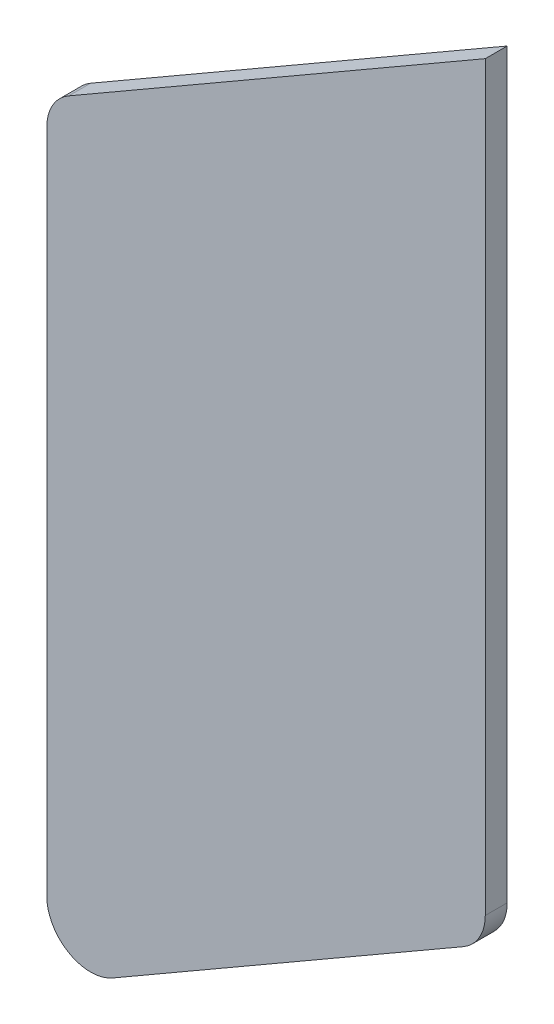
ISO-10303-21;
HEADER;
FILE_DESCRIPTION(('STEP AP214'),'2;1');
FILE_NAME('part.step','',(''),(''),'','','');
FILE_SCHEMA(('AUTOMOTIVE_DESIGN { 1 0 10303 214 1 1 1 1 }'));
ENDSEC;
DATA;
#1=APPLICATION_CONTEXT('core data for automotive mechanical design processes');
#2=APPLICATION_PROTOCOL_DEFINITION('international standard','automotive_design',2000,#1);
#3=PRODUCT_CONTEXT('',#1,'mechanical');
#4=PRODUCT('Part','Part','',(#3));
#5=PRODUCT_RELATED_PRODUCT_CATEGORY('part','',(#4));
#6=PRODUCT_DEFINITION_FORMATION('','',#4);
#7=PRODUCT_DEFINITION_CONTEXT('part definition',#1,'design');
#8=PRODUCT_DEFINITION('design','',#6,#7);
#9=PRODUCT_DEFINITION_SHAPE('','',#8);
#10=(LENGTH_UNIT() NAMED_UNIT(*) SI_UNIT(.MILLI.,.METRE.));
#11=(NAMED_UNIT(*) PLANE_ANGLE_UNIT() SI_UNIT($,.RADIAN.));
#12=(NAMED_UNIT(*) SI_UNIT($,.STERADIAN.) SOLID_ANGLE_UNIT());
#13=UNCERTAINTY_MEASURE_WITH_UNIT(LENGTH_MEASURE(1.E-05),#10,'distance_accuracy_value','');
#14=(GEOMETRIC_REPRESENTATION_CONTEXT(3) GLOBAL_UNCERTAINTY_ASSIGNED_CONTEXT((#13)) GLOBAL_UNIT_ASSIGNED_CONTEXT((#10,
#11,#12)) REPRESENTATION_CONTEXT('',''));
#15=CARTESIAN_POINT('',(0.,0.,0.));
#16=DIRECTION('',(0.,0.,1.));
#17=DIRECTION('',(1.,0.,0.));
#18=AXIS2_PLACEMENT_3D('',#15,#16,#17);
#19=CARTESIAN_POINT('',(47.5000000000002,139.461524227067,5.));
#20=DIRECTION('',(1.,0.,0.));
#21=DIRECTION('',(0.,1.,0.));
#22=AXIS2_PLACEMENT_3D('',#19,#20,#21);
#23=PLANE('',#22);
#24=DIRECTION('',(0.,-1.,0.));
#25=VECTOR('',#24,1.);
#26=CARTESIAN_POINT('',(47.5000000000002,139.461524227067,0.));
#27=LINE('',#26,#25);
#28=CARTESIAN_POINT('',(47.5000000000002,139.461524227067,0.));
#29=VERTEX_POINT('',#28);
#30=CARTESIAN_POINT('',(47.5000000000002,-29.7649730810358,0.));
#31=VERTEX_POINT('',#30);
#32=EDGE_CURVE('E130',#29,#31,#27,.T.);
#33=ORIENTED_EDGE('',*,*,#32,.F.);
#34=DIRECTION('',(0.,0.,-1.));
#35=VECTOR('',#34,1.);
#36=CARTESIAN_POINT('',(47.5000000000002,139.461524227067,5.));
#37=LINE('',#36,#35);
#38=CARTESIAN_POINT('',(47.5000000000002,139.461524227067,5.));
#39=VERTEX_POINT('',#38);
#40=EDGE_CURVE('E11',#39,#29,#37,.T.);
#41=ORIENTED_EDGE('',*,*,#40,.F.);
#42=DIRECTION('',(0.,-1.,0.));
#43=VECTOR('',#42,1.);
#44=CARTESIAN_POINT('',(47.5000000000002,139.461524227067,5.));
#45=LINE('',#44,#43);
#46=CARTESIAN_POINT('',(47.5000000000002,-29.7649730810358,5.));
#47=VERTEX_POINT('',#46);
#48=EDGE_CURVE('E145',#39,#47,#45,.T.);
#49=ORIENTED_EDGE('',*,*,#48,.T.);
#50=DIRECTION('',(0.,0.,-1.));
#51=VECTOR('',#50,1.);
#52=CARTESIAN_POINT('',(47.5000000000002,-29.7649730810358,5.));
#53=LINE('',#52,#51);
#54=EDGE_CURVE('E40',#47,#31,#53,.T.);
#55=ORIENTED_EDGE('',*,*,#54,.T.);
#56=EDGE_LOOP('',(#33,#41,#49,#55));
#57=FACE_BOUND('',#56,.T.);
#58=ADVANCED_FACE('F37',(#57),#23,.T.);
#59=CARTESIAN_POINT('',(47.5000000000002,139.461524227067,5.));
#60=DIRECTION('',(0.500000000000007,-0.866025403784434,0.));
#61=DIRECTION('',(0.866025403784435,0.500000000000007,0.));
#62=AXIS2_PLACEMENT_3D('',#59,#60,#61);
#63=PLANE('',#62);
#64=DIRECTION('',(-0.866025403784435,-0.500000000000007,0.));
#65=VECTOR('',#64,1.);
#66=CARTESIAN_POINT('',(47.5000000000002,139.461524227067,0.));
#67=LINE('',#66,#65);
#68=CARTESIAN_POINT('',(-47.5000000000002,84.6132486540517,0.));
#69=VERTEX_POINT('',#68);
#70=EDGE_CURVE('E79',#29,#69,#67,.T.);
#71=ORIENTED_EDGE('',*,*,#70,.T.);
#72=DIRECTION('',(0.,0.,-1.));
#73=VECTOR('',#72,1.);
#74=CARTESIAN_POINT('',(-47.5000000000002,84.6132486540517,5.));
#75=LINE('',#74,#73);
#76=CARTESIAN_POINT('',(-47.5000000000002,84.6132486540517,5.));
#77=VERTEX_POINT('',#76);
#78=EDGE_CURVE('E46',#77,#69,#75,.T.);
#79=ORIENTED_EDGE('',*,*,#78,.F.);
#80=DIRECTION('',(-0.866025403784435,-0.500000000000007,0.));
#81=VECTOR('',#80,1.);
#82=CARTESIAN_POINT('',(47.5000000000002,139.461524227067,5.));
#83=LINE('',#82,#81);
#84=EDGE_CURVE('E108',#39,#77,#83,.T.);
#85=ORIENTED_EDGE('',*,*,#84,.F.);
#86=ORIENTED_EDGE('',*,*,#40,.T.);
#87=EDGE_LOOP('',(#71,#79,#85,#86));
#88=FACE_BOUND('',#87,.T.);
#89=ADVANCED_FACE('F173',(#88),#63,.F.);
#90=CARTESIAN_POINT('',(-42.4999999999998,75.9529946162071,5.));
#91=DIRECTION('',(0.,0.,-1.));
#92=DIRECTION('',(-1.,0.,0.));
#93=AXIS2_PLACEMENT_3D('',#90,#91,#92);
#94=CYLINDRICAL_SURFACE('',#93,10.0000000000002);
#95=CARTESIAN_POINT('',(-42.4999999999998,75.9529946162071,0.));
#96=DIRECTION('',(0.,0.,1.));
#97=DIRECTION('',(1.,0.,0.));
#98=AXIS2_PLACEMENT_3D('',#95,#96,#97);
#99=CIRCLE('',#98,10.0000000000002);
#100=CARTESIAN_POINT('',(-52.5,75.9529946162071,0.));
#101=VERTEX_POINT('',#100);
#102=EDGE_CURVE('E115',#69,#101,#99,.T.);
#103=ORIENTED_EDGE('',*,*,#102,.T.);
#104=DIRECTION('',(0.,0.,-1.));
#105=VECTOR('',#104,1.);
#106=CARTESIAN_POINT('',(-52.5,75.9529946162071,5.));
#107=LINE('',#106,#105);
#108=CARTESIAN_POINT('',(-52.5,75.9529946162071,5.));
#109=VERTEX_POINT('',#108);
#110=EDGE_CURVE('E112',#109,#101,#107,.T.);
#111=ORIENTED_EDGE('',*,*,#110,.F.);
#112=CARTESIAN_POINT('',(-42.4999999999998,75.9529946162071,5.));
#113=DIRECTION('',(0.,0.,1.));
#114=DIRECTION('',(1.,0.,0.));
#115=AXIS2_PLACEMENT_3D('',#112,#113,#114);
#116=CIRCLE('',#115,10.0000000000002);
#117=EDGE_CURVE('E100',#77,#109,#116,.T.);
#118=ORIENTED_EDGE('',*,*,#117,.F.);
#119=ORIENTED_EDGE('',*,*,#78,.T.);
#120=EDGE_LOOP('',(#103,#111,#118,#119));
#121=FACE_BOUND('',#120,.T.);
#122=ADVANCED_FACE('F113',(#121),#94,.T.);
#123=CARTESIAN_POINT('',(-52.4999999999997,75.9529946162071,5.));
#124=DIRECTION('',(1.,0.,0.));
#125=DIRECTION('',(0.,0.,-1.));
#126=AXIS2_PLACEMENT_3D('',#123,#124,#125);
#127=PLANE('',#126);
#128=DIRECTION('',(0.,-1.,0.));
#129=VECTOR('',#128,1.);
#130=CARTESIAN_POINT('',(-52.4999999999997,75.9529946162071,0.));
#131=LINE('',#130,#129);
#132=CARTESIAN_POINT('',(-52.4999999999997,-75.9529946162071,0.));
#133=VERTEX_POINT('',#132);
#134=EDGE_CURVE('E142',#101,#133,#131,.T.);
#135=ORIENTED_EDGE('',*,*,#134,.T.);
#136=DIRECTION('',(0.,0.,-1.));
#137=VECTOR('',#136,1.);
#138=CARTESIAN_POINT('',(-52.4999999999997,-75.9529946162071,5.));
#139=LINE('',#138,#137);
#140=CARTESIAN_POINT('',(-52.4999999999997,-75.9529946162071,5.));
#141=VERTEX_POINT('',#140);
#142=EDGE_CURVE('E119',#141,#133,#139,.T.);
#143=ORIENTED_EDGE('',*,*,#142,.F.);
#144=DIRECTION('',(0.,-1.,0.));
#145=VECTOR('',#144,1.);
#146=CARTESIAN_POINT('',(-52.4999999999997,75.9529946162071,5.));
#147=LINE('',#146,#145);
#148=EDGE_CURVE('E106',#109,#141,#147,.T.);
#149=ORIENTED_EDGE('',*,*,#148,.F.);
#150=ORIENTED_EDGE('',*,*,#110,.T.);
#151=EDGE_LOOP('',(#135,#143,#149,#150));
#152=FACE_BOUND('',#151,.T.);
#153=ADVANCED_FACE('F121',(#152),#127,.F.);
#154=CARTESIAN_POINT('',(-42.4999999999997,-75.9529946162071,5.));
#155=DIRECTION('',(0.,0.,-1.));
#156=DIRECTION('',(-1.,0.,0.));
#157=AXIS2_PLACEMENT_3D('',#154,#155,#156);
#158=CYLINDRICAL_SURFACE('',#157,10.);
#159=CARTESIAN_POINT('',(-42.4999999999997,-75.9529946162071,0.));
#160=DIRECTION('',(0.,0.,-1.));
#161=DIRECTION('',(-1.,0.,0.));
#162=AXIS2_PLACEMENT_3D('',#159,#160,#161);
#163=CIRCLE('',#162,10.);
#164=CARTESIAN_POINT('',(-37.5,-84.6132486540517,0.));
#165=VERTEX_POINT('',#164);
#166=EDGE_CURVE('E139',#165,#133,#163,.T.);
#167=ORIENTED_EDGE('',*,*,#166,.F.);
#168=DIRECTION('',(0.,0.,-1.));
#169=VECTOR('',#168,1.);
#170=CARTESIAN_POINT('',(-37.5,-84.6132486540517,5.));
#171=LINE('',#170,#169);
#172=CARTESIAN_POINT('',(-37.5,-84.6132486540517,5.));
#173=VERTEX_POINT('',#172);
#174=EDGE_CURVE('E149',#173,#165,#171,.T.);
#175=ORIENTED_EDGE('',*,*,#174,.F.);
#176=CARTESIAN_POINT('',(-42.4999999999997,-75.9529946162071,5.));
#177=DIRECTION('',(0.,0.,-1.));
#178=DIRECTION('',(-1.,0.,0.));
#179=AXIS2_PLACEMENT_3D('',#176,#177,#178);
#180=CIRCLE('',#179,10.);
#181=EDGE_CURVE('E123',#173,#141,#180,.T.);
#182=ORIENTED_EDGE('',*,*,#181,.T.);
#183=ORIENTED_EDGE('',*,*,#142,.T.);
#184=EDGE_LOOP('',(#167,#175,#182,#183));
#185=FACE_BOUND('',#184,.T.);
#186=ADVANCED_FACE('F157',(#185),#158,.T.);
#187=CARTESIAN_POINT('',(42.5000000000004,-38.4252271188801,5.));
#188=DIRECTION('',(0.50000000000001,-0.866025403784433,0.));
#189=DIRECTION('',(0.866025403784433,0.50000000000001,0.));
#190=AXIS2_PLACEMENT_3D('',#187,#188,#189);
#191=PLANE('',#190);
#192=DIRECTION('',(-0.866025403784433,-0.50000000000001,0.));
#193=VECTOR('',#192,1.);
#194=CARTESIAN_POINT('',(42.5000000000004,-38.4252271188801,0.));
#195=LINE('',#194,#193);
#196=CARTESIAN_POINT('',(42.5000000000004,-38.4252271188801,0.));
#197=VERTEX_POINT('',#196);
#198=EDGE_CURVE('E136',#197,#165,#195,.T.);
#199=ORIENTED_EDGE('',*,*,#198,.F.);
#200=DIRECTION('',(0.,0.,-1.));
#201=VECTOR('',#200,1.);
#202=CARTESIAN_POINT('',(42.5000000000004,-38.4252271188801,5.));
#203=LINE('',#202,#201);
#204=CARTESIAN_POINT('',(42.5000000000004,-38.4252271188801,5.));
#205=VERTEX_POINT('',#204);
#206=EDGE_CURVE('E150',#205,#197,#203,.T.);
#207=ORIENTED_EDGE('',*,*,#206,.F.);
#208=DIRECTION('',(-0.866025403784433,-0.50000000000001,0.));
#209=VECTOR('',#208,1.);
#210=CARTESIAN_POINT('',(42.5000000000004,-38.4252271188801,5.));
#211=LINE('',#210,#209);
#212=EDGE_CURVE('E125',#205,#173,#211,.T.);
#213=ORIENTED_EDGE('',*,*,#212,.T.);
#214=ORIENTED_EDGE('',*,*,#174,.T.);
#215=EDGE_LOOP('',(#199,#207,#213,#214));
#216=FACE_BOUND('',#215,.T.);
#217=ADVANCED_FACE('F161',(#216),#191,.T.);
#218=CARTESIAN_POINT('',(37.5000000000003,-29.7649730810361,5.));
#219=DIRECTION('',(0.,0.,-1.));
#220=DIRECTION('',(-1.,0.,0.));
#221=AXIS2_PLACEMENT_3D('',#218,#219,#220);
#222=CYLINDRICAL_SURFACE('',#221,9.99999999999982);
#223=CARTESIAN_POINT('',(37.5000000000003,-29.7649730810361,0.));
#224=DIRECTION('',(0.,0.,-1.));
#225=DIRECTION('',(-1.,0.,0.));
#226=AXIS2_PLACEMENT_3D('',#223,#224,#225);
#227=CIRCLE('',#226,9.99999999999982);
#228=EDGE_CURVE('E133',#31,#197,#227,.T.);
#229=ORIENTED_EDGE('',*,*,#228,.F.);
#230=ORIENTED_EDGE('',*,*,#54,.F.);
#231=CARTESIAN_POINT('',(37.5000000000003,-29.7649730810361,5.));
#232=DIRECTION('',(0.,0.,-1.));
#233=DIRECTION('',(-1.,0.,0.));
#234=AXIS2_PLACEMENT_3D('',#231,#232,#233);
#235=CIRCLE('',#234,9.99999999999982);
#236=EDGE_CURVE('E162',#47,#205,#235,.T.);
#237=ORIENTED_EDGE('',*,*,#236,.T.);
#238=ORIENTED_EDGE('',*,*,#206,.T.);
#239=EDGE_LOOP('',(#229,#230,#237,#238));
#240=FACE_BOUND('',#239,.T.);
#241=ADVANCED_FACE('F152',(#240),#222,.T.);
#242=CARTESIAN_POINT('',(37.5000000000003,-29.7649730810361,5.));
#243=DIRECTION('',(0.,0.,-1.));
#244=DIRECTION('',(-1.,0.,0.));
#245=AXIS2_PLACEMENT_3D('',#242,#243,#244);
#246=PLANE('',#245);
#247=ORIENTED_EDGE('',*,*,#48,.F.);
#248=ORIENTED_EDGE('',*,*,#84,.T.);
#249=ORIENTED_EDGE('',*,*,#117,.T.);
#250=ORIENTED_EDGE('',*,*,#148,.T.);
#251=ORIENTED_EDGE('',*,*,#181,.F.);
#252=ORIENTED_EDGE('',*,*,#212,.F.);
#253=ORIENTED_EDGE('',*,*,#236,.F.);
#254=EDGE_LOOP('',(#247,#248,#249,#250,#251,#252,#253));
#255=FACE_BOUND('',#254,.T.);
#256=ADVANCED_FACE('F103',(#255),#246,.F.);
#257=CARTESIAN_POINT('',(37.5000000000003,-29.7649730810361,0.));
#258=DIRECTION('',(0.,0.,-1.));
#259=DIRECTION('',(-1.,0.,0.));
#260=AXIS2_PLACEMENT_3D('',#257,#258,#259);
#261=PLANE('',#260);
#262=ORIENTED_EDGE('',*,*,#32,.T.);
#263=ORIENTED_EDGE('',*,*,#228,.T.);
#264=ORIENTED_EDGE('',*,*,#198,.T.);
#265=ORIENTED_EDGE('',*,*,#166,.T.);
#266=ORIENTED_EDGE('',*,*,#134,.F.);
#267=ORIENTED_EDGE('',*,*,#102,.F.);
#268=ORIENTED_EDGE('',*,*,#70,.F.);
#269=EDGE_LOOP('',(#262,#263,#264,#265,#266,#267,#268));
#270=FACE_BOUND('',#269,.T.);
#271=ADVANCED_FACE('F154',(#270),#261,.T.);
#272=CLOSED_SHELL('',(#58,#89,#122,#153,#186,#217,#241,#256,#271));
#273=MANIFOLD_SOLID_BREP('B2',#272);
#274=ADVANCED_BREP_SHAPE_REPRESENTATION('',(#18,#273),#14);
#275=SHAPE_DEFINITION_REPRESENTATION(#9,#274);
ENDSEC;
END-ISO-10303-21;
